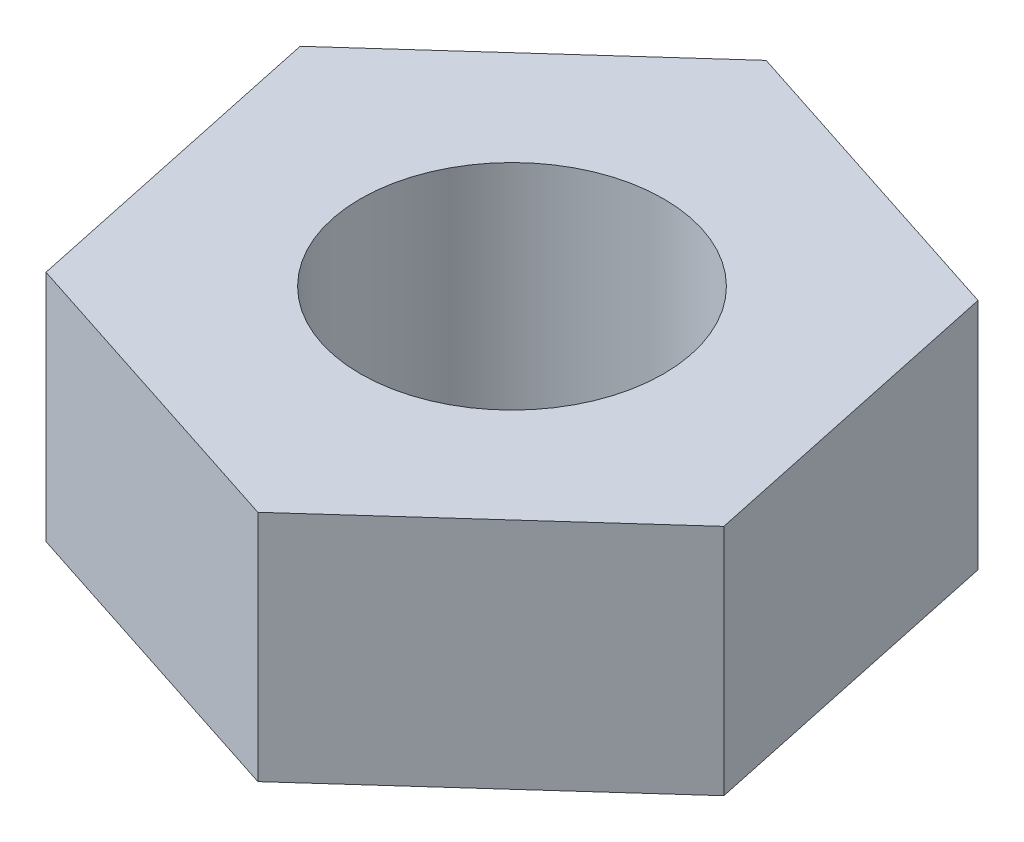
ISO-10303-21;
HEADER;
FILE_DESCRIPTION(('STEP AP214'),'2;1');
FILE_NAME('part.step','',(''),(''),'','','');
FILE_SCHEMA(('AUTOMOTIVE_DESIGN { 1 0 10303 214 1 1 1 1 }'));
ENDSEC;
DATA;
#1=APPLICATION_CONTEXT('core data for automotive mechanical design processes');
#2=APPLICATION_PROTOCOL_DEFINITION('international standard','automotive_design',2000,#1);
#3=PRODUCT_CONTEXT('',#1,'mechanical');
#4=PRODUCT('Part','Part','',(#3));
#5=PRODUCT_RELATED_PRODUCT_CATEGORY('part','',(#4));
#6=PRODUCT_DEFINITION_FORMATION('','',#4);
#7=PRODUCT_DEFINITION_CONTEXT('part definition',#1,'design');
#8=PRODUCT_DEFINITION('design','',#6,#7);
#9=PRODUCT_DEFINITION_SHAPE('','',#8);
#10=(LENGTH_UNIT() NAMED_UNIT(*) SI_UNIT(.MILLI.,.METRE.));
#11=(NAMED_UNIT(*) PLANE_ANGLE_UNIT() SI_UNIT($,.RADIAN.));
#12=(NAMED_UNIT(*) SI_UNIT($,.STERADIAN.) SOLID_ANGLE_UNIT());
#13=UNCERTAINTY_MEASURE_WITH_UNIT(LENGTH_MEASURE(1.E-05),#10,'distance_accuracy_value','');
#14=(GEOMETRIC_REPRESENTATION_CONTEXT(3) GLOBAL_UNCERTAINTY_ASSIGNED_CONTEXT((#13)) GLOBAL_UNIT_ASSIGNED_CONTEXT((#10,
#11,#12)) REPRESENTATION_CONTEXT('',''));
#15=CARTESIAN_POINT('',(0.,0.,0.));
#16=DIRECTION('',(0.,0.,1.));
#17=DIRECTION('',(1.,0.,0.));
#18=AXIS2_PLACEMENT_3D('',#15,#16,#17);
#19=CARTESIAN_POINT('',(18.93394801386,9.,7.491575510831));
#20=DIRECTION('',(0.,-1.,0.));
#21=DIRECTION('',(0.743144825477457,0.,-0.669130606358789));
#22=AXIS2_PLACEMENT_3D('',#19,#20,#21);
#23=PLANE('',#22);
#24=CARTESIAN_POINT('',(22.82535639108,9.,7.416407864999));
#25=DIRECTION('',(0.,-1.,0.));
#26=DIRECTION('',(0.,0.,-1.));
#27=AXIS2_PLACEMENT_3D('',#24,#25,#26);
#28=CIRCLE('',#27,1.29999999999987);
#29=CARTESIAN_POINT('',(22.82535639108,9.,6.11640786499913));
#30=VERTEX_POINT('',#29);
#31=EDGE_CURVE('E21',#30,#30,#28,.F.);
#32=ORIENTED_EDGE('',*,*,#31,.T.);
#33=EDGE_LOOP('',(#32));
#34=FACE_BOUND('',#33,.T.);
#35=DIRECTION('',(-0.207911690817755,0.,-0.978147600733807));
#36=VECTOR('',#35,1.);
#37=CARTESIAN_POINT('',(25.221818012885,9.,6.9070242224955));
#38=LINE('',#37,#36);
#39=CARTESIAN_POINT('',(24.9277252297912,9.,5.52342646018876));
#40=VERTEX_POINT('',#39);
#41=CARTESIAN_POINT('',(25.5159107960032,9.,8.29062198494326));
#42=VERTEX_POINT('',#41);
#43=EDGE_CURVE('E104',#40,#42,#38,.F.);
#44=ORIENTED_EDGE('',*,*,#43,.T.);
#45=DIRECTION('',(0.743144825478725,0.,-0.66913060635738));
#46=VECTOR('',#45,1.);
#47=CARTESIAN_POINT('',(24.464726376665,9.,9.237112687417));
#48=LINE('',#47,#46);
#49=CARTESIAN_POINT('',(23.413541957321,9.,10.1836033898913));
#50=VERTEX_POINT('',#49);
#51=EDGE_CURVE('E83',#42,#50,#48,.F.);
#52=ORIENTED_EDGE('',*,*,#51,.T.);
#53=DIRECTION('',(0.951056516295282,0.,0.309016994374551));
#54=VECTOR('',#53,1.);
#55=CARTESIAN_POINT('',(22.068264754865,9.,9.7464963299205));
#56=LINE('',#55,#54);
#57=CARTESIAN_POINT('',(20.7229875525461,9.,9.30938926999502));
#58=VERTEX_POINT('',#57);
#59=EDGE_CURVE('E80',#50,#58,#56,.F.);
#60=ORIENTED_EDGE('',*,*,#59,.T.);
#61=DIRECTION('',(0.207911690817754,0.,0.978147600733807));
#62=VECTOR('',#61,1.);
#63=CARTESIAN_POINT('',(20.428894769285,9.,7.9257915075025));
#64=LINE('',#63,#62);
#65=CARTESIAN_POINT('',(20.1348019861681,9.,6.54219374505447));
#66=VERTEX_POINT('',#65);
#67=EDGE_CURVE('E81',#58,#66,#64,.F.);
#68=ORIENTED_EDGE('',*,*,#67,.T.);
#69=DIRECTION('',(-0.74314482547822,0.,0.669130606357941));
#70=VECTOR('',#69,1.);
#71=CARTESIAN_POINT('',(21.185986405505,9.,5.5957030425795));
#72=LINE('',#71,#70);
#73=CARTESIAN_POINT('',(22.2371708248414,9.,4.64921234010567));
#74=VERTEX_POINT('',#73);
#75=EDGE_CURVE('E110',#66,#74,#72,.F.);
#76=ORIENTED_EDGE('',*,*,#75,.T.);
#77=DIRECTION('',(-0.951056516295308,0.,-0.309016994374473));
#78=VECTOR('',#77,1.);
#79=CARTESIAN_POINT('',(23.5824480273,9.,5.086319400076));
#80=LINE('',#79,#78);
#81=EDGE_CURVE('E105',#74,#40,#80,.F.);
#82=ORIENTED_EDGE('',*,*,#81,.T.);
#83=EDGE_LOOP('',(#44,#52,#60,#68,#76,#82));
#84=FACE_BOUND('',#83,.T.);
#85=ADVANCED_FACE('F17',(#34,#84),#23,.T.);
#86=CARTESIAN_POINT('',(20.09275460939,11.04,6.580053373154));
#87=DIRECTION('',(-0.669130606357941,0.,-0.74314482547822));
#88=DIRECTION('',(0.74314482547822,0.,-0.669130606357941));
#89=AXIS2_PLACEMENT_3D('',#86,#87,#88);
#90=PLANE('',#89);
#91=ORIENTED_EDGE('',*,*,#75,.F.);
#92=DIRECTION('',(0.,-1.,0.));
#93=VECTOR('',#92,1.);
#94=CARTESIAN_POINT('',(20.1348019861651,10.,6.54219374505605));
#95=LINE('',#94,#93);
#96=CARTESIAN_POINT('',(20.1348019861654,11.,6.54219374505748));
#97=VERTEX_POINT('',#96);
#98=EDGE_CURVE('E90',#66,#97,#95,.F.);
#99=ORIENTED_EDGE('',*,*,#98,.T.);
#100=DIRECTION('',(0.743144825477464,0.,-0.669130606358781));
#101=VECTOR('',#100,1.);
#102=CARTESIAN_POINT('',(21.1859864055089,11.,5.59570304257962));
#103=LINE('',#102,#101);
#104=CARTESIAN_POINT('',(22.2371708248427,11.,4.64921234010527));
#105=VERTEX_POINT('',#104);
#106=EDGE_CURVE('E58',#97,#105,#103,.T.);
#107=ORIENTED_EDGE('',*,*,#106,.T.);
#108=DIRECTION('',(0.,1.,0.));
#109=VECTOR('',#108,1.);
#110=CARTESIAN_POINT('',(22.2371708248399,10.,4.64921234010435));
#111=LINE('',#110,#109);
#112=EDGE_CURVE('E51',#105,#74,#111,.F.);
#113=ORIENTED_EDGE('',*,*,#112,.T.);
#114=EDGE_LOOP('',(#91,#99,#107,#113));
#115=FACE_BOUND('',#114,.T.);
#116=ADVANCED_FACE('F122',(#115),#90,.T.);
#117=CARTESIAN_POINT('',(22.18335973674,11.04,4.631728057705));
#118=DIRECTION('',(0.309016994374473,0.,-0.951056516295308));
#119=DIRECTION('',(0.951056516295308,0.,0.309016994374473));
#120=AXIS2_PLACEMENT_3D('',#117,#118,#119);
#121=PLANE('',#120);
#122=ORIENTED_EDGE('',*,*,#81,.F.);
#123=ORIENTED_EDGE('',*,*,#112,.F.);
#124=DIRECTION('',(0.951056516295308,0.,0.309016994374473));
#125=VECTOR('',#124,1.);
#126=CARTESIAN_POINT('',(22.18335973674,11.,4.631728057705));
#127=LINE('',#126,#125);
#128=CARTESIAN_POINT('',(24.9277252297649,11.,5.52342646004815));
#129=VERTEX_POINT('',#128);
#130=EDGE_CURVE('E112',#105,#129,#127,.T.);
#131=ORIENTED_EDGE('',*,*,#130,.T.);
#132=DIRECTION('',(0.,1.,0.));
#133=VECTOR('',#132,1.);
#134=CARTESIAN_POINT('',(24.9277252297646,10.,5.52342646004702));
#135=LINE('',#134,#133);
#136=EDGE_CURVE('E101',#129,#40,#135,.F.);
#137=ORIENTED_EDGE('',*,*,#136,.T.);
#138=EDGE_LOOP('',(#122,#123,#131,#137));
#139=FACE_BOUND('',#138,.T.);
#140=ADVANCED_FACE('F118',(#139),#121,.T.);
#141=CARTESIAN_POINT('',(24.91596151844,11.04,5.46808254955));
#142=DIRECTION('',(0.978147600733806,0.,-0.207911690817755));
#143=DIRECTION('',(0.207911690817755,0.,0.978147600733806));
#144=AXIS2_PLACEMENT_3D('',#141,#142,#143);
#145=PLANE('',#144);
#146=ORIENTED_EDGE('',*,*,#43,.F.);
#147=ORIENTED_EDGE('',*,*,#136,.F.);
#148=DIRECTION('',(0.207911690817755,0.,0.978147600733806));
#149=VECTOR('',#148,1.);
#150=CARTESIAN_POINT('',(24.91596151844,11.,5.46808254955));
#151=LINE('',#150,#149);
#152=CARTESIAN_POINT('',(25.5159107960043,11.,8.29062198494246));
#153=VERTEX_POINT('',#152);
#154=EDGE_CURVE('E116',#129,#153,#151,.T.);
#155=ORIENTED_EDGE('',*,*,#154,.T.);
#156=DIRECTION('',(0.,1.,0.));
#157=VECTOR('',#156,1.);
#158=CARTESIAN_POINT('',(25.5159107960028,10.,8.29062198494613));
#159=LINE('',#158,#157);
#160=EDGE_CURVE('E106',#153,#42,#159,.F.);
#161=ORIENTED_EDGE('',*,*,#160,.T.);
#162=EDGE_LOOP('',(#146,#147,#155,#161));
#163=FACE_BOUND('',#162,.T.);
#164=ADVANCED_FACE('F128',(#163),#145,.T.);
#165=CARTESIAN_POINT('',(25.55795817278,11.04,8.252762356844));
#166=DIRECTION('',(0.66913060635738,0.,0.743144825478725));
#167=DIRECTION('',(-0.743144825478725,0.,0.66913060635738));
#168=AXIS2_PLACEMENT_3D('',#165,#166,#167);
#169=PLANE('',#168);
#170=ORIENTED_EDGE('',*,*,#51,.F.);
#171=ORIENTED_EDGE('',*,*,#160,.F.);
#172=DIRECTION('',(-0.743144825477788,0.,0.669130606358421));
#173=VECTOR('',#172,1.);
#174=CARTESIAN_POINT('',(24.4647263766622,11.,9.23711268741653));
#175=LINE('',#174,#173);
#176=CARTESIAN_POINT('',(23.4135419573213,11.,10.183603389891));
#177=VERTEX_POINT('',#176);
#178=EDGE_CURVE('E99',#153,#177,#175,.T.);
#179=ORIENTED_EDGE('',*,*,#178,.T.);
#180=DIRECTION('',(0.,1.,0.));
#181=VECTOR('',#180,1.);
#182=CARTESIAN_POINT('',(23.4135419573198,10.,10.1836033898906));
#183=LINE('',#182,#181);
#184=EDGE_CURVE('E86',#177,#50,#183,.F.);
#185=ORIENTED_EDGE('',*,*,#184,.T.);
#186=EDGE_LOOP('',(#170,#171,#179,#185));
#187=FACE_BOUND('',#186,.T.);
#188=ADVANCED_FACE('F125',(#187),#169,.T.);
#189=CARTESIAN_POINT('',(23.46735304542,11.04,10.20108767229));
#190=DIRECTION('',(-0.309016994374551,0.,0.951056516295283));
#191=DIRECTION('',(-0.951056516295283,0.,-0.309016994374551));
#192=AXIS2_PLACEMENT_3D('',#189,#190,#191);
#193=PLANE('',#192);
#194=ORIENTED_EDGE('',*,*,#59,.F.);
#195=ORIENTED_EDGE('',*,*,#184,.F.);
#196=DIRECTION('',(-0.951056516295283,0.,-0.309016994374551));
#197=VECTOR('',#196,1.);
#198=CARTESIAN_POINT('',(23.46735304542,11.,10.20108767229));
#199=LINE('',#198,#197);
#200=CARTESIAN_POINT('',(20.7229875524051,11.,9.30938926994986));
#201=VERTEX_POINT('',#200);
#202=EDGE_CURVE('E95',#177,#201,#199,.T.);
#203=ORIENTED_EDGE('',*,*,#202,.T.);
#204=DIRECTION('',(0.,1.,0.));
#205=VECTOR('',#204,1.);
#206=CARTESIAN_POINT('',(20.7229875524054,10.,9.30938926995099));
#207=LINE('',#206,#205);
#208=EDGE_CURVE('E36',#201,#58,#207,.F.);
#209=ORIENTED_EDGE('',*,*,#208,.T.);
#210=EDGE_LOOP('',(#194,#195,#203,#209));
#211=FACE_BOUND('',#210,.T.);
#212=ADVANCED_FACE('F93',(#211),#193,.T.);
#213=CARTESIAN_POINT('',(20.73475126373,11.04,9.364733180448));
#214=DIRECTION('',(-0.978147600733807,0.,0.207911690817754));
#215=DIRECTION('',(-0.207911690817754,0.,-0.978147600733807));
#216=AXIS2_PLACEMENT_3D('',#213,#214,#215);
#217=PLANE('',#216);
#218=ORIENTED_EDGE('',*,*,#67,.F.);
#219=ORIENTED_EDGE('',*,*,#208,.F.);
#220=DIRECTION('',(-0.207911690817754,0.,-0.978147600733807));
#221=VECTOR('',#220,1.);
#222=CARTESIAN_POINT('',(20.73475126373,11.,9.364733180448));
#223=LINE('',#222,#221);
#224=EDGE_CURVE('E27',#201,#97,#223,.T.);
#225=ORIENTED_EDGE('',*,*,#224,.T.);
#226=ORIENTED_EDGE('',*,*,#98,.F.);
#227=EDGE_LOOP('',(#218,#219,#225,#226));
#228=FACE_BOUND('',#227,.T.);
#229=ADVANCED_FACE('F89',(#228),#217,.T.);
#230=CARTESIAN_POINT('',(22.82535639108,11.,7.416407864999));
#231=DIRECTION('',(0.,-1.,0.));
#232=DIRECTION('',(0.,0.,-1.));
#233=AXIS2_PLACEMENT_3D('',#230,#231,#232);
#234=CYLINDRICAL_SURFACE('',#233,1.29999999999987);
#235=ORIENTED_EDGE('',*,*,#31,.F.);
#236=EDGE_LOOP('',(#235));
#237=FACE_BOUND('',#236,.T.);
#238=CARTESIAN_POINT('',(22.82535639108,11.,7.416407864999));
#239=DIRECTION('',(0.,-1.,0.));
#240=DIRECTION('',(0.,0.,-1.));
#241=AXIS2_PLACEMENT_3D('',#238,#239,#240);
#242=CIRCLE('',#241,1.29999999999987);
#243=CARTESIAN_POINT('',(22.82535639108,11.,6.11640786499913));
#244=VERTEX_POINT('',#243);
#245=EDGE_CURVE('E11',#244,#244,#242,.F.);
#246=ORIENTED_EDGE('',*,*,#245,.T.);
#247=EDGE_LOOP('',(#246));
#248=FACE_BOUND('',#247,.T.);
#249=ADVANCED_FACE('F143',(#237,#248),#234,.F.);
#250=CARTESIAN_POINT('',(18.93394801386,11.,7.491575510831));
#251=DIRECTION('',(0.,-1.,0.));
#252=DIRECTION('',(0.743144825477457,0.,-0.669130606358789));
#253=AXIS2_PLACEMENT_3D('',#250,#251,#252);
#254=PLANE('',#253);
#255=ORIENTED_EDGE('',*,*,#245,.F.);
#256=EDGE_LOOP('',(#255));
#257=FACE_BOUND('',#256,.T.);
#258=ORIENTED_EDGE('',*,*,#202,.F.);
#259=ORIENTED_EDGE('',*,*,#178,.F.);
#260=ORIENTED_EDGE('',*,*,#154,.F.);
#261=ORIENTED_EDGE('',*,*,#130,.F.);
#262=ORIENTED_EDGE('',*,*,#106,.F.);
#263=ORIENTED_EDGE('',*,*,#224,.F.);
#264=EDGE_LOOP('',(#258,#259,#260,#261,#262,#263));
#265=FACE_BOUND('',#264,.T.);
#266=ADVANCED_FACE('F19',(#257,#265),#254,.F.);
#267=CLOSED_SHELL('',(#85,#116,#140,#164,#188,#212,#229,#249,#266));
#268=MANIFOLD_SOLID_BREP('B1',#267);
#269=ADVANCED_BREP_SHAPE_REPRESENTATION('',(#18,#268),#14);
#270=SHAPE_DEFINITION_REPRESENTATION(#9,#269);
ENDSEC;
END-ISO-10303-21;
